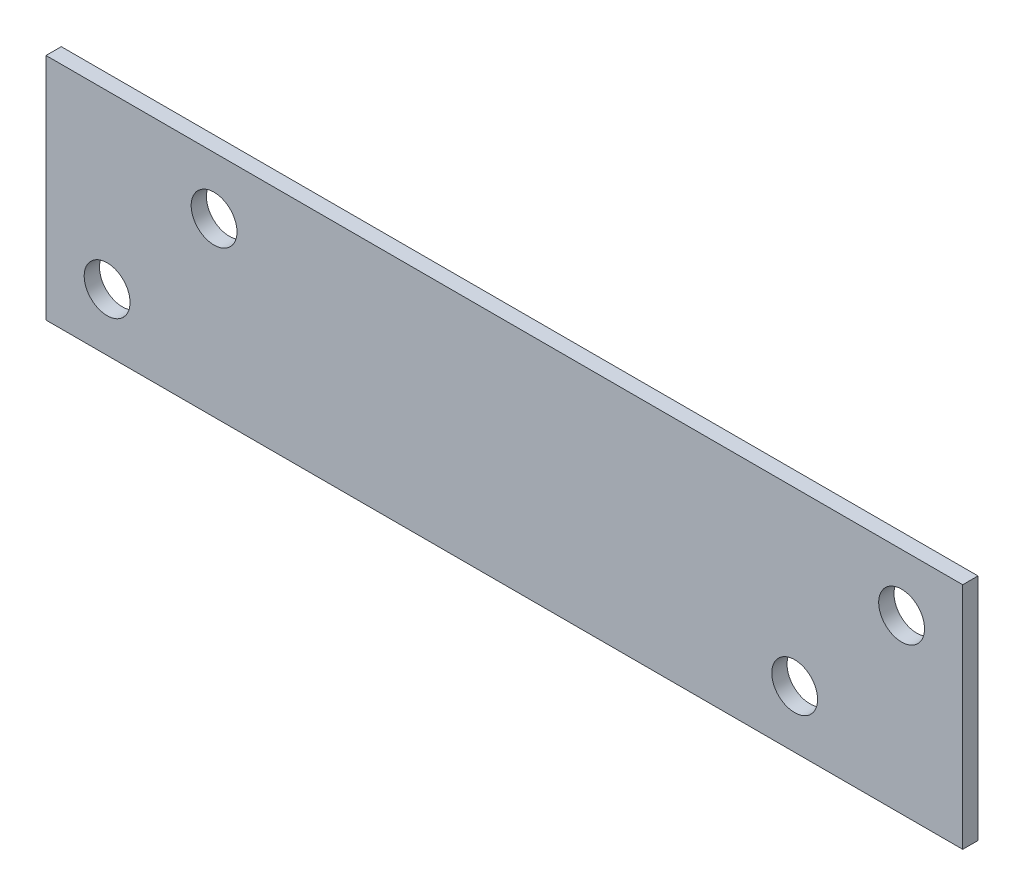
ISO-10303-21;
HEADER;
FILE_DESCRIPTION(('STEP AP214'),'2;1');
FILE_NAME('part.step','',(''),(''),'','','');
FILE_SCHEMA(('AUTOMOTIVE_DESIGN { 1 0 10303 214 1 1 1 1 }'));
ENDSEC;
DATA;
#1=APPLICATION_CONTEXT('core data for automotive mechanical design processes');
#2=APPLICATION_PROTOCOL_DEFINITION('international standard','automotive_design',2000,#1);
#3=PRODUCT_CONTEXT('',#1,'mechanical');
#4=PRODUCT('Part','Part','',(#3));
#5=PRODUCT_RELATED_PRODUCT_CATEGORY('part','',(#4));
#6=PRODUCT_DEFINITION_FORMATION('','',#4);
#7=PRODUCT_DEFINITION_CONTEXT('part definition',#1,'design');
#8=PRODUCT_DEFINITION('design','',#6,#7);
#9=PRODUCT_DEFINITION_SHAPE('','',#8);
#10=(LENGTH_UNIT() NAMED_UNIT(*) SI_UNIT(.MILLI.,.METRE.));
#11=(NAMED_UNIT(*) PLANE_ANGLE_UNIT() SI_UNIT($,.RADIAN.));
#12=(NAMED_UNIT(*) SI_UNIT($,.STERADIAN.) SOLID_ANGLE_UNIT());
#13=UNCERTAINTY_MEASURE_WITH_UNIT(LENGTH_MEASURE(1.E-05),#10,'distance_accuracy_value','');
#14=(GEOMETRIC_REPRESENTATION_CONTEXT(3) GLOBAL_UNCERTAINTY_ASSIGNED_CONTEXT((#13)) GLOBAL_UNIT_ASSIGNED_CONTEXT((#10,
#11,#12)) REPRESENTATION_CONTEXT('',''));
#15=CARTESIAN_POINT('',(0.,0.,0.));
#16=DIRECTION('',(0.,0.,1.));
#17=DIRECTION('',(1.,0.,0.));
#18=AXIS2_PLACEMENT_3D('',#15,#16,#17);
#19=CARTESIAN_POINT('',(0.,0.,-1.));
#20=DIRECTION('',(-1.,0.,0.));
#21=DIRECTION('',(0.,0.,1.));
#22=AXIS2_PLACEMENT_3D('',#19,#20,#21);
#23=PLANE('',#22);
#24=DIRECTION('',(0.,-1.,0.));
#25=VECTOR('',#24,1.);
#26=CARTESIAN_POINT('',(0.,0.,0.));
#27=LINE('',#26,#25);
#28=CARTESIAN_POINT('',(0.,15.,0.));
#29=VERTEX_POINT('',#28);
#30=CARTESIAN_POINT('',(0.,0.,0.));
#31=VERTEX_POINT('',#30);
#32=EDGE_CURVE('E114',#29,#31,#27,.T.);
#33=ORIENTED_EDGE('',*,*,#32,.F.);
#34=DIRECTION('',(0.,0.,1.));
#35=VECTOR('',#34,1.);
#36=CARTESIAN_POINT('',(0.,15.,-1.));
#37=LINE('',#36,#35);
#38=CARTESIAN_POINT('',(0.,15.,-1.));
#39=VERTEX_POINT('',#38);
#40=EDGE_CURVE('E11',#39,#29,#37,.T.);
#41=ORIENTED_EDGE('',*,*,#40,.F.);
#42=DIRECTION('',(0.,-1.,0.));
#43=VECTOR('',#42,1.);
#44=CARTESIAN_POINT('',(0.,0.,-1.));
#45=LINE('',#44,#43);
#46=CARTESIAN_POINT('',(0.,0.,-1.));
#47=VERTEX_POINT('',#46);
#48=EDGE_CURVE('E105',#39,#47,#45,.T.);
#49=ORIENTED_EDGE('',*,*,#48,.T.);
#50=DIRECTION('',(0.,0.,1.));
#51=VECTOR('',#50,1.);
#52=CARTESIAN_POINT('',(0.,0.,-1.));
#53=LINE('',#52,#51);
#54=EDGE_CURVE('E46',#47,#31,#53,.T.);
#55=ORIENTED_EDGE('',*,*,#54,.T.);
#56=EDGE_LOOP('',(#33,#41,#49,#55));
#57=FACE_BOUND('',#56,.T.);
#58=ADVANCED_FACE('F43',(#57),#23,.T.);
#59=CARTESIAN_POINT('',(0.,15.,-1.));
#60=DIRECTION('',(0.,1.,0.));
#61=DIRECTION('',(-1.,0.,0.));
#62=AXIS2_PLACEMENT_3D('',#59,#60,#61);
#63=PLANE('',#62);
#64=DIRECTION('',(-1.,0.,0.));
#65=VECTOR('',#64,1.);
#66=CARTESIAN_POINT('',(0.,15.,0.));
#67=LINE('',#66,#65);
#68=CARTESIAN_POINT('',(60.,15.,0.));
#69=VERTEX_POINT('',#68);
#70=EDGE_CURVE('E108',#69,#29,#67,.T.);
#71=ORIENTED_EDGE('',*,*,#70,.F.);
#72=DIRECTION('',(0.,0.,1.));
#73=VECTOR('',#72,1.);
#74=CARTESIAN_POINT('',(60.,15.,-1.));
#75=LINE('',#74,#73);
#76=CARTESIAN_POINT('',(60.,15.,-1.));
#77=VERTEX_POINT('',#76);
#78=EDGE_CURVE('E53',#77,#69,#75,.T.);
#79=ORIENTED_EDGE('',*,*,#78,.F.);
#80=DIRECTION('',(-1.,0.,0.));
#81=VECTOR('',#80,1.);
#82=CARTESIAN_POINT('',(0.,15.,-1.));
#83=LINE('',#82,#81);
#84=EDGE_CURVE('E100',#77,#39,#83,.T.);
#85=ORIENTED_EDGE('',*,*,#84,.T.);
#86=ORIENTED_EDGE('',*,*,#40,.T.);
#87=EDGE_LOOP('',(#71,#79,#85,#86));
#88=FACE_BOUND('',#87,.T.);
#89=ADVANCED_FACE('F131',(#88),#63,.T.);
#90=CARTESIAN_POINT('',(60.,0.,-1.));
#91=DIRECTION('',(1.,0.,0.));
#92=DIRECTION('',(0.,0.,-1.));
#93=AXIS2_PLACEMENT_3D('',#90,#91,#92);
#94=PLANE('',#93);
#95=DIRECTION('',(0.,1.,0.));
#96=VECTOR('',#95,1.);
#97=CARTESIAN_POINT('',(60.,0.,0.));
#98=LINE('',#97,#96);
#99=CARTESIAN_POINT('',(60.,0.,0.));
#100=VERTEX_POINT('',#99);
#101=EDGE_CURVE('E94',#100,#69,#98,.T.);
#102=ORIENTED_EDGE('',*,*,#101,.F.);
#103=DIRECTION('',(0.,0.,1.));
#104=VECTOR('',#103,1.);
#105=CARTESIAN_POINT('',(60.,0.,-1.));
#106=LINE('',#105,#104);
#107=CARTESIAN_POINT('',(60.,0.,-1.));
#108=VERTEX_POINT('',#107);
#109=EDGE_CURVE('E89',#108,#100,#106,.T.);
#110=ORIENTED_EDGE('',*,*,#109,.F.);
#111=DIRECTION('',(0.,1.,0.));
#112=VECTOR('',#111,1.);
#113=CARTESIAN_POINT('',(60.,0.,-1.));
#114=LINE('',#113,#112);
#115=EDGE_CURVE('E92',#108,#77,#114,.T.);
#116=ORIENTED_EDGE('',*,*,#115,.T.);
#117=ORIENTED_EDGE('',*,*,#78,.T.);
#118=EDGE_LOOP('',(#102,#110,#116,#117));
#119=FACE_BOUND('',#118,.T.);
#120=ADVANCED_FACE('F91',(#119),#94,.T.);
#121=CARTESIAN_POINT('',(0.,0.,-1.));
#122=DIRECTION('',(0.,-1.,0.));
#123=DIRECTION('',(0.,0.,-1.));
#124=AXIS2_PLACEMENT_3D('',#121,#122,#123);
#125=PLANE('',#124);
#126=DIRECTION('',(1.,0.,0.));
#127=VECTOR('',#126,1.);
#128=CARTESIAN_POINT('',(0.,0.,0.));
#129=LINE('',#128,#127);
#130=EDGE_CURVE('E118',#31,#100,#129,.T.);
#131=ORIENTED_EDGE('',*,*,#130,.F.);
#132=ORIENTED_EDGE('',*,*,#54,.F.);
#133=DIRECTION('',(1.,0.,0.));
#134=VECTOR('',#133,1.);
#135=CARTESIAN_POINT('',(0.,0.,-1.));
#136=LINE('',#135,#134);
#137=EDGE_CURVE('E99',#47,#108,#136,.T.);
#138=ORIENTED_EDGE('',*,*,#137,.T.);
#139=ORIENTED_EDGE('',*,*,#109,.T.);
#140=EDGE_LOOP('',(#131,#132,#138,#139));
#141=FACE_BOUND('',#140,.T.);
#142=ADVANCED_FACE('F103',(#141),#125,.T.);
#143=CARTESIAN_POINT('',(0.,0.,-1.));
#144=DIRECTION('',(0.,0.,-1.));
#145=DIRECTION('',(-1.,0.,0.));
#146=AXIS2_PLACEMENT_3D('',#143,#144,#145);
#147=PLANE('',#146);
#148=CARTESIAN_POINT('',(49.,3.75,-1.));
#149=DIRECTION('',(0.,0.,1.));
#150=DIRECTION('',(1.,0.,0.));
#151=AXIS2_PLACEMENT_3D('',#148,#149,#150);
#152=CIRCLE('',#151,1.5);
#153=CARTESIAN_POINT('',(50.5,3.75,-1.));
#154=VERTEX_POINT('',#153);
#155=EDGE_CURVE('E172',#154,#154,#152,.T.);
#156=ORIENTED_EDGE('',*,*,#155,.T.);
#157=EDGE_LOOP('',(#156));
#158=FACE_BOUND('',#157,.T.);
#159=CARTESIAN_POINT('',(56.,11.25,-1.));
#160=DIRECTION('',(0.,0.,1.));
#161=DIRECTION('',(1.,0.,0.));
#162=AXIS2_PLACEMENT_3D('',#159,#160,#161);
#163=CIRCLE('',#162,1.5);
#164=CARTESIAN_POINT('',(57.5,11.25,-1.));
#165=VERTEX_POINT('',#164);
#166=EDGE_CURVE('E182',#165,#165,#163,.T.);
#167=ORIENTED_EDGE('',*,*,#166,.T.);
#168=EDGE_LOOP('',(#167));
#169=FACE_BOUND('',#168,.T.);
#170=CARTESIAN_POINT('',(4.,3.75,-1.));
#171=DIRECTION('',(0.,0.,1.));
#172=DIRECTION('',(1.,0.,0.));
#173=AXIS2_PLACEMENT_3D('',#170,#171,#172);
#174=CIRCLE('',#173,1.5);
#175=CARTESIAN_POINT('',(5.5,3.75,-1.));
#176=VERTEX_POINT('',#175);
#177=EDGE_CURVE('E190',#176,#176,#174,.T.);
#178=ORIENTED_EDGE('',*,*,#177,.T.);
#179=EDGE_LOOP('',(#178));
#180=FACE_BOUND('',#179,.T.);
#181=CARTESIAN_POINT('',(11.,11.25,-1.));
#182=DIRECTION('',(0.,0.,1.));
#183=DIRECTION('',(1.,0.,0.));
#184=AXIS2_PLACEMENT_3D('',#181,#182,#183);
#185=CIRCLE('',#184,1.5);
#186=CARTESIAN_POINT('',(12.5,11.25,-1.));
#187=VERTEX_POINT('',#186);
#188=EDGE_CURVE('E119',#187,#187,#185,.T.);
#189=ORIENTED_EDGE('',*,*,#188,.T.);
#190=EDGE_LOOP('',(#189));
#191=FACE_BOUND('',#190,.T.);
#192=ORIENTED_EDGE('',*,*,#48,.F.);
#193=ORIENTED_EDGE('',*,*,#84,.F.);
#194=ORIENTED_EDGE('',*,*,#115,.F.);
#195=ORIENTED_EDGE('',*,*,#137,.F.);
#196=EDGE_LOOP('',(#192,#193,#194,#195));
#197=FACE_BOUND('',#196,.T.);
#198=ADVANCED_FACE('F98',(#158,#169,#180,#191,#197),#147,.T.);
#199=CARTESIAN_POINT('',(0.,0.,0.));
#200=DIRECTION('',(0.,0.,-1.));
#201=DIRECTION('',(-1.,0.,0.));
#202=AXIS2_PLACEMENT_3D('',#199,#200,#201);
#203=PLANE('',#202);
#204=CARTESIAN_POINT('',(49.,3.75,0.));
#205=DIRECTION('',(0.,0.,1.));
#206=DIRECTION('',(1.,0.,0.));
#207=AXIS2_PLACEMENT_3D('',#204,#205,#206);
#208=CIRCLE('',#207,1.5);
#209=CARTESIAN_POINT('',(50.5,3.75,0.));
#210=VERTEX_POINT('',#209);
#211=EDGE_CURVE('E175',#210,#210,#208,.T.);
#212=ORIENTED_EDGE('',*,*,#211,.F.);
#213=EDGE_LOOP('',(#212));
#214=FACE_BOUND('',#213,.T.);
#215=CARTESIAN_POINT('',(56.,11.25,0.));
#216=DIRECTION('',(0.,0.,1.));
#217=DIRECTION('',(1.,0.,0.));
#218=AXIS2_PLACEMENT_3D('',#215,#216,#217);
#219=CIRCLE('',#218,1.5);
#220=CARTESIAN_POINT('',(57.5,11.25,0.));
#221=VERTEX_POINT('',#220);
#222=EDGE_CURVE('E179',#221,#221,#219,.T.);
#223=ORIENTED_EDGE('',*,*,#222,.F.);
#224=EDGE_LOOP('',(#223));
#225=FACE_BOUND('',#224,.T.);
#226=CARTESIAN_POINT('',(4.,3.75,0.));
#227=DIRECTION('',(0.,0.,1.));
#228=DIRECTION('',(1.,0.,0.));
#229=AXIS2_PLACEMENT_3D('',#226,#227,#228);
#230=CIRCLE('',#229,1.5);
#231=CARTESIAN_POINT('',(5.5,3.75,0.));
#232=VERTEX_POINT('',#231);
#233=EDGE_CURVE('E186',#232,#232,#230,.T.);
#234=ORIENTED_EDGE('',*,*,#233,.F.);
#235=EDGE_LOOP('',(#234));
#236=FACE_BOUND('',#235,.T.);
#237=CARTESIAN_POINT('',(11.,11.25,0.));
#238=DIRECTION('',(0.,0.,1.));
#239=DIRECTION('',(1.,0.,0.));
#240=AXIS2_PLACEMENT_3D('',#237,#238,#239);
#241=CIRCLE('',#240,1.5);
#242=CARTESIAN_POINT('',(12.5,11.25,0.));
#243=VERTEX_POINT('',#242);
#244=EDGE_CURVE('E194',#243,#243,#241,.T.);
#245=ORIENTED_EDGE('',*,*,#244,.F.);
#246=EDGE_LOOP('',(#245));
#247=FACE_BOUND('',#246,.T.);
#248=ORIENTED_EDGE('',*,*,#32,.T.);
#249=ORIENTED_EDGE('',*,*,#130,.T.);
#250=ORIENTED_EDGE('',*,*,#101,.T.);
#251=ORIENTED_EDGE('',*,*,#70,.T.);
#252=EDGE_LOOP('',(#248,#249,#250,#251));
#253=FACE_BOUND('',#252,.T.);
#254=ADVANCED_FACE('F130',(#214,#225,#236,#247,#253),#203,.F.);
#255=CARTESIAN_POINT('',(11.,11.25,-1.));
#256=DIRECTION('',(0.,0.,1.));
#257=DIRECTION('',(1.,0.,0.));
#258=AXIS2_PLACEMENT_3D('',#255,#256,#257);
#259=CYLINDRICAL_SURFACE('',#258,1.5);
#260=ORIENTED_EDGE('',*,*,#188,.F.);
#261=EDGE_LOOP('',(#260));
#262=FACE_BOUND('',#261,.T.);
#263=ORIENTED_EDGE('',*,*,#244,.T.);
#264=EDGE_LOOP('',(#263));
#265=FACE_BOUND('',#264,.T.);
#266=ADVANCED_FACE('F149',(#262,#265),#259,.F.);
#267=CARTESIAN_POINT('',(4.,3.75,-1.));
#268=DIRECTION('',(0.,0.,1.));
#269=DIRECTION('',(1.,0.,0.));
#270=AXIS2_PLACEMENT_3D('',#267,#268,#269);
#271=CYLINDRICAL_SURFACE('',#270,1.5);
#272=ORIENTED_EDGE('',*,*,#177,.F.);
#273=EDGE_LOOP('',(#272));
#274=FACE_BOUND('',#273,.T.);
#275=ORIENTED_EDGE('',*,*,#233,.T.);
#276=EDGE_LOOP('',(#275));
#277=FACE_BOUND('',#276,.T.);
#278=ADVANCED_FACE('F156',(#274,#277),#271,.F.);
#279=CARTESIAN_POINT('',(56.,11.25,-1.));
#280=DIRECTION('',(0.,0.,1.));
#281=DIRECTION('',(1.,0.,0.));
#282=AXIS2_PLACEMENT_3D('',#279,#280,#281);
#283=CYLINDRICAL_SURFACE('',#282,1.5);
#284=ORIENTED_EDGE('',*,*,#166,.F.);
#285=EDGE_LOOP('',(#284));
#286=FACE_BOUND('',#285,.T.);
#287=ORIENTED_EDGE('',*,*,#222,.T.);
#288=EDGE_LOOP('',(#287));
#289=FACE_BOUND('',#288,.T.);
#290=ADVANCED_FACE('F160',(#286,#289),#283,.F.);
#291=CARTESIAN_POINT('',(49.,3.75,-1.));
#292=DIRECTION('',(0.,0.,1.));
#293=DIRECTION('',(1.,0.,0.));
#294=AXIS2_PLACEMENT_3D('',#291,#292,#293);
#295=CYLINDRICAL_SURFACE('',#294,1.5);
#296=ORIENTED_EDGE('',*,*,#155,.F.);
#297=EDGE_LOOP('',(#296));
#298=FACE_BOUND('',#297,.T.);
#299=ORIENTED_EDGE('',*,*,#211,.T.);
#300=EDGE_LOOP('',(#299));
#301=FACE_BOUND('',#300,.T.);
#302=ADVANCED_FACE('F164',(#298,#301),#295,.F.);
#303=CLOSED_SHELL('',(#58,#89,#120,#142,#198,#254,#266,#278,#290,#302));
#304=MANIFOLD_SOLID_BREP('B2',#303);
#305=ADVANCED_BREP_SHAPE_REPRESENTATION('',(#18,#304),#14);
#306=SHAPE_DEFINITION_REPRESENTATION(#9,#305);
ENDSEC;
END-ISO-10303-21;
